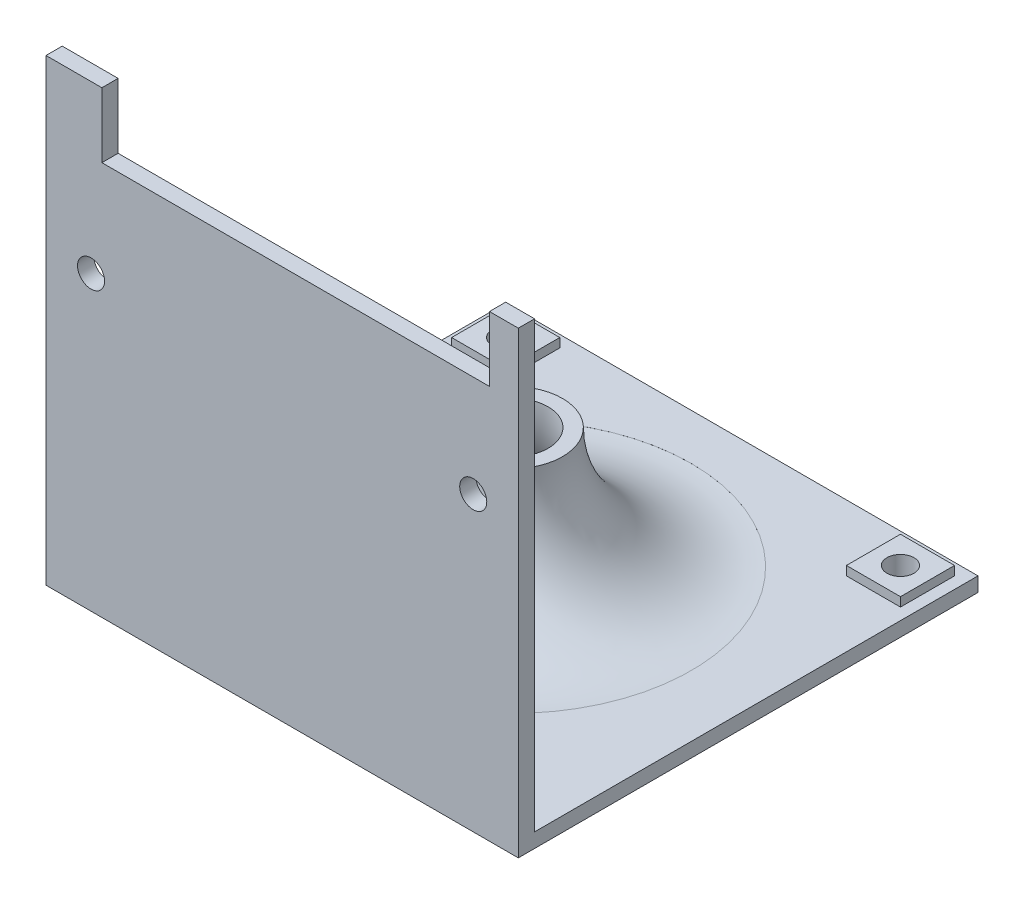
ISO-10303-21;
HEADER;
FILE_DESCRIPTION(('STEP AP214'),'2;1');
FILE_NAME('part.step','',(''),(''),'','','');
FILE_SCHEMA(('AUTOMOTIVE_DESIGN { 1 0 10303 214 1 1 1 1 }'));
ENDSEC;
DATA;
#1=APPLICATION_CONTEXT('core data for automotive mechanical design processes');
#2=APPLICATION_PROTOCOL_DEFINITION('international standard','automotive_design',2000,#1);
#3=PRODUCT_CONTEXT('',#1,'mechanical');
#4=PRODUCT('Part','Part','',(#3));
#5=PRODUCT_RELATED_PRODUCT_CATEGORY('part','',(#4));
#6=PRODUCT_DEFINITION_FORMATION('','',#4);
#7=PRODUCT_DEFINITION_CONTEXT('part definition',#1,'design');
#8=PRODUCT_DEFINITION('design','',#6,#7);
#9=PRODUCT_DEFINITION_SHAPE('','',#8);
#10=(LENGTH_UNIT() NAMED_UNIT(*) SI_UNIT(.MILLI.,.METRE.));
#11=(NAMED_UNIT(*) PLANE_ANGLE_UNIT() SI_UNIT($,.RADIAN.));
#12=(NAMED_UNIT(*) SI_UNIT($,.STERADIAN.) SOLID_ANGLE_UNIT());
#13=UNCERTAINTY_MEASURE_WITH_UNIT(LENGTH_MEASURE(1.E-05),#10,'distance_accuracy_value','');
#14=(GEOMETRIC_REPRESENTATION_CONTEXT(3) GLOBAL_UNCERTAINTY_ASSIGNED_CONTEXT((#13)) GLOBAL_UNIT_ASSIGNED_CONTEXT((#10,
#11,#12)) REPRESENTATION_CONTEXT('',''));
#15=CARTESIAN_POINT('',(0.,0.,0.));
#16=DIRECTION('',(0.,0.,1.));
#17=DIRECTION('',(1.,0.,0.));
#18=AXIS2_PLACEMENT_3D('',#15,#16,#17);
#19=CARTESIAN_POINT('',(0.,50.9,0.));
#20=DIRECTION('',(0.,1.,0.));
#21=DIRECTION('',(0.,0.,1.));
#22=AXIS2_PLACEMENT_3D('',#19,#20,#21);
#23=PLANE('',#22);
#24=DIRECTION('',(0.,0.,-1.));
#25=VECTOR('',#24,1.);
#26=CARTESIAN_POINT('',(23.5,50.9,0.));
#27=LINE('',#26,#25);
#28=CARTESIAN_POINT('',(23.5,50.9,26.));
#29=VERTEX_POINT('',#28);
#30=CARTESIAN_POINT('',(23.5,50.9,24.2));
#31=VERTEX_POINT('',#30);
#32=EDGE_CURVE('E41',#29,#31,#27,.T.);
#33=ORIENTED_EDGE('',*,*,#32,.F.);
#34=DIRECTION('',(1.,0.,0.));
#35=VECTOR('',#34,1.);
#36=CARTESIAN_POINT('',(26.7,50.9,26.));
#37=LINE('',#36,#35);
#38=CARTESIAN_POINT('',(26.7,50.9,26.));
#39=VERTEX_POINT('',#38);
#40=EDGE_CURVE('E175',#29,#39,#37,.T.);
#41=ORIENTED_EDGE('',*,*,#40,.T.);
#42=DIRECTION('',(0.,0.,-1.));
#43=VECTOR('',#42,1.);
#44=CARTESIAN_POINT('',(26.7,50.9,26.));
#45=LINE('',#44,#43);
#46=CARTESIAN_POINT('',(26.7,50.9,24.2));
#47=VERTEX_POINT('',#46);
#48=EDGE_CURVE('E196',#39,#47,#45,.T.);
#49=ORIENTED_EDGE('',*,*,#48,.T.);
#50=DIRECTION('',(-1.,0.,0.));
#51=VECTOR('',#50,1.);
#52=CARTESIAN_POINT('',(26.7,50.9,24.2));
#53=LINE('',#52,#51);
#54=EDGE_CURVE('E177',#47,#31,#53,.T.);
#55=ORIENTED_EDGE('',*,*,#54,.T.);
#56=EDGE_LOOP('',(#33,#41,#49,#55));
#57=FACE_BOUND('',#56,.T.);
#58=ADVANCED_FACE('F33',(#57),#23,.T.);
#59=CARTESIAN_POINT('',(0.,1.6,0.));
#60=DIRECTION('',(0.,1.,0.));
#61=DIRECTION('',(0.,0.,1.));
#62=AXIS2_PLACEMENT_3D('',#59,#60,#61);
#63=PLANE('',#62);
#64=DIRECTION('',(-1.,0.,0.));
#65=VECTOR('',#64,1.);
#66=CARTESIAN_POINT('',(26.7,1.6,24.2));
#67=LINE('',#66,#65);
#68=CARTESIAN_POINT('',(26.7,1.6,24.2));
#69=VERTEX_POINT('',#68);
#70=CARTESIAN_POINT('',(-25.7,1.6,24.2));
#71=VERTEX_POINT('',#70);
#72=EDGE_CURVE('E193',#69,#71,#67,.T.);
#73=ORIENTED_EDGE('',*,*,#72,.F.);
#74=DIRECTION('',(0.,0.,-1.));
#75=VECTOR('',#74,1.);
#76=CARTESIAN_POINT('',(26.7,1.6,-25.));
#77=LINE('',#76,#75);
#78=CARTESIAN_POINT('',(26.7,1.6,-25.));
#79=VERTEX_POINT('',#78);
#80=EDGE_CURVE('E209',#69,#79,#77,.T.);
#81=ORIENTED_EDGE('',*,*,#80,.T.);
#82=DIRECTION('',(-1.,0.,0.));
#83=VECTOR('',#82,1.);
#84=CARTESIAN_POINT('',(-25.7,1.6,-25.));
#85=LINE('',#84,#83);
#86=CARTESIAN_POINT('',(-25.7,1.6,-25.));
#87=VERTEX_POINT('',#86);
#88=EDGE_CURVE('E212',#79,#87,#85,.T.);
#89=ORIENTED_EDGE('',*,*,#88,.T.);
#90=DIRECTION('',(0.,0.,1.));
#91=VECTOR('',#90,1.);
#92=CARTESIAN_POINT('',(-25.7,1.6,-25.));
#93=LINE('',#92,#91);
#94=EDGE_CURVE('E207',#87,#71,#93,.T.);
#95=ORIENTED_EDGE('',*,*,#94,.T.);
#96=EDGE_LOOP('',(#73,#81,#89,#95));
#97=FACE_BOUND('',#96,.T.);
#98=CARTESIAN_POINT('',(0.,1.6,0.));
#99=DIRECTION('',(0.,1.,0.));
#100=DIRECTION('',(0.,0.,1.));
#101=AXIS2_PLACEMENT_3D('',#98,#99,#100);
#102=CIRCLE('',#101,19.8968814968815);
#103=CARTESIAN_POINT('',(0.,1.6,19.8968814968815));
#104=VERTEX_POINT('',#103);
#105=EDGE_CURVE('E203',#104,#104,#102,.T.);
#106=ORIENTED_EDGE('',*,*,#105,.F.);
#107=EDGE_LOOP('',(#106));
#108=FACE_BOUND('',#107,.T.);
#109=DIRECTION('',(-1.,0.,0.));
#110=VECTOR('',#109,1.);
#111=CARTESIAN_POINT('',(25.4,1.6,-23.7));
#112=LINE('',#111,#110);
#113=CARTESIAN_POINT('',(25.4,1.6,-23.7));
#114=VERTEX_POINT('',#113);
#115=CARTESIAN_POINT('',(19.4,1.6,-23.7));
#116=VERTEX_POINT('',#115);
#117=EDGE_CURVE('E308',#114,#116,#112,.T.);
#118=ORIENTED_EDGE('',*,*,#117,.F.);
#119=DIRECTION('',(0.,0.,-1.));
#120=VECTOR('',#119,1.);
#121=CARTESIAN_POINT('',(25.4,1.6,-23.7));
#122=LINE('',#121,#120);
#123=CARTESIAN_POINT('',(25.4,1.6,-17.7));
#124=VERTEX_POINT('',#123);
#125=EDGE_CURVE('E294',#124,#114,#122,.T.);
#126=ORIENTED_EDGE('',*,*,#125,.F.);
#127=DIRECTION('',(1.,0.,0.));
#128=VECTOR('',#127,1.);
#129=CARTESIAN_POINT('',(25.4,1.6,-17.7));
#130=LINE('',#129,#128);
#131=CARTESIAN_POINT('',(19.4,1.6,-17.7));
#132=VERTEX_POINT('',#131);
#133=EDGE_CURVE('E299',#132,#124,#130,.T.);
#134=ORIENTED_EDGE('',*,*,#133,.F.);
#135=DIRECTION('',(0.,0.,1.));
#136=VECTOR('',#135,1.);
#137=CARTESIAN_POINT('',(19.4,1.6,-23.7));
#138=LINE('',#137,#136);
#139=EDGE_CURVE('E310',#116,#132,#138,.T.);
#140=ORIENTED_EDGE('',*,*,#139,.F.);
#141=EDGE_LOOP('',(#118,#126,#134,#140));
#142=FACE_BOUND('',#141,.T.);
#143=DIRECTION('',(1.,0.,0.));
#144=VECTOR('',#143,1.);
#145=CARTESIAN_POINT('',(-24.4,1.6,-17.7));
#146=LINE('',#145,#144);
#147=CARTESIAN_POINT('',(-24.4,1.6,-17.7));
#148=VERTEX_POINT('',#147);
#149=CARTESIAN_POINT('',(-18.4,1.6,-17.7));
#150=VERTEX_POINT('',#149);
#151=EDGE_CURVE('E281',#148,#150,#146,.T.);
#152=ORIENTED_EDGE('',*,*,#151,.F.);
#153=DIRECTION('',(0.,0.,1.));
#154=VECTOR('',#153,1.);
#155=CARTESIAN_POINT('',(-24.4,1.6,-23.7));
#156=LINE('',#155,#154);
#157=CARTESIAN_POINT('',(-24.4,1.6,-23.7));
#158=VERTEX_POINT('',#157);
#159=EDGE_CURVE('E267',#158,#148,#156,.T.);
#160=ORIENTED_EDGE('',*,*,#159,.F.);
#161=DIRECTION('',(-1.,0.,0.));
#162=VECTOR('',#161,1.);
#163=CARTESIAN_POINT('',(-24.4,1.6,-23.7));
#164=LINE('',#163,#162);
#165=CARTESIAN_POINT('',(-18.4,1.6,-23.7));
#166=VERTEX_POINT('',#165);
#167=EDGE_CURVE('E272',#166,#158,#164,.T.);
#168=ORIENTED_EDGE('',*,*,#167,.F.);
#169=DIRECTION('',(0.,0.,-1.));
#170=VECTOR('',#169,1.);
#171=CARTESIAN_POINT('',(-18.4,1.6,-23.7));
#172=LINE('',#171,#170);
#173=EDGE_CURVE('E283',#150,#166,#172,.T.);
#174=ORIENTED_EDGE('',*,*,#173,.F.);
#175=EDGE_LOOP('',(#152,#160,#168,#174));
#176=FACE_BOUND('',#175,.T.);
#177=ADVANCED_FACE('F365',(#97,#108,#142,#176),#63,.T.);
#178=CARTESIAN_POINT('',(0.,15.,0.));
#179=DIRECTION('',(0.,-1.,0.));
#180=DIRECTION('',(0.,0.,-1.));
#181=AXIS2_PLACEMENT_3D('',#178,#179,#180);
#182=TOROIDAL_SURFACE('',#181,19.03125,15.03125);
#183=CARTESIAN_POINT('',(0.,0.,0.));
#184=DIRECTION('',(0.,1.,0.));
#185=DIRECTION('',(0.,0.,1.));
#186=AXIS2_PLACEMENT_3D('',#183,#184,#185);
#187=CIRCLE('',#186,20.);
#188=CARTESIAN_POINT('',(0.,0.,20.));
#189=VERTEX_POINT('',#188);
#190=EDGE_CURVE('E231',#189,#189,#187,.F.);
#191=ORIENTED_EDGE('',*,*,#190,.T.);
#192=EDGE_LOOP('',(#191));
#193=FACE_BOUND('',#192,.T.);
#194=CARTESIAN_POINT('',(0.,15.,0.));
#195=DIRECTION('',(0.,-1.,0.));
#196=DIRECTION('',(0.,0.,-1.));
#197=AXIS2_PLACEMENT_3D('',#194,#195,#196);
#198=CIRCLE('',#197,4.);
#199=CARTESIAN_POINT('',(0.,15.,-4.));
#200=VERTEX_POINT('',#199);
#201=EDGE_CURVE('E234',#200,#200,#198,.T.);
#202=ORIENTED_EDGE('',*,*,#201,.F.);
#203=EDGE_LOOP('',(#202));
#204=FACE_BOUND('',#203,.T.);
#205=ADVANCED_FACE('F35',(#193,#204),#182,.T.);
#206=CARTESIAN_POINT('',(0.,15.,0.));
#207=DIRECTION('',(0.,-1.,0.));
#208=DIRECTION('',(0.,0.,-1.));
#209=AXIS2_PLACEMENT_3D('',#206,#207,#208);
#210=TOROIDAL_SURFACE('',#209,19.03125,13.43125);
#211=CARTESIAN_POINT('',(0.,15.,0.));
#212=DIRECTION('',(0.,-1.,0.));
#213=DIRECTION('',(0.,0.,-1.));
#214=AXIS2_PLACEMENT_3D('',#211,#212,#213);
#215=CIRCLE('',#214,5.6);
#216=CARTESIAN_POINT('',(0.,15.,-5.6));
#217=VERTEX_POINT('',#216);
#218=EDGE_CURVE('E237',#217,#217,#215,.T.);
#219=ORIENTED_EDGE('',*,*,#218,.T.);
#220=EDGE_LOOP('',(#219));
#221=FACE_BOUND('',#220,.T.);
#222=CARTESIAN_POINT('',(0.,1.5966735966736,0.));
#223=DIRECTION('',(0.,-1.,0.));
#224=DIRECTION('',(0.,0.,-1.));
#225=AXIS2_PLACEMENT_3D('',#222,#223,#224);
#226=CIRCLE('',#225,19.8968814968815);
#227=CARTESIAN_POINT('',(0.,1.5966735966736,-19.8968814968815));
#228=VERTEX_POINT('',#227);
#229=EDGE_CURVE('E240',#228,#228,#226,.T.);
#230=ORIENTED_EDGE('',*,*,#229,.F.);
#231=EDGE_LOOP('',(#230));
#232=FACE_BOUND('',#231,.T.);
#233=ADVANCED_FACE('F409',(#221,#232),#210,.F.);
#234=CARTESIAN_POINT('',(4.,15.,0.));
#235=DIRECTION('',(0.,1.,0.));
#236=DIRECTION('',(0.,0.,1.));
#237=AXIS2_PLACEMENT_3D('',#234,#235,#236);
#238=PLANE('',#237);
#239=ORIENTED_EDGE('',*,*,#201,.T.);
#240=EDGE_LOOP('',(#239));
#241=FACE_BOUND('',#240,.T.);
#242=ORIENTED_EDGE('',*,*,#218,.F.);
#243=EDGE_LOOP('',(#242));
#244=FACE_BOUND('',#243,.T.);
#245=ADVANCED_FACE('F394',(#241,#244),#238,.T.);
#246=CARTESIAN_POINT('',(0.,0.,0.));
#247=DIRECTION('',(0.,1.,0.));
#248=DIRECTION('',(0.,0.,1.));
#249=AXIS2_PLACEMENT_3D('',#246,#247,#248);
#250=PLANE('',#249);
#251=CARTESIAN_POINT('',(22.4,0.,-20.7));
#252=DIRECTION('',(0.,1.,0.));
#253=DIRECTION('',(0.,0.,1.));
#254=AXIS2_PLACEMENT_3D('',#251,#252,#253);
#255=CIRCLE('',#254,1.5);
#256=CARTESIAN_POINT('',(22.4,0.,-19.2));
#257=VERTEX_POINT('',#256);
#258=EDGE_CURVE('E264',#257,#257,#255,.T.);
#259=ORIENTED_EDGE('',*,*,#258,.T.);
#260=EDGE_LOOP('',(#259));
#261=FACE_BOUND('',#260,.T.);
#262=CARTESIAN_POINT('',(-21.4,0.,-20.7));
#263=DIRECTION('',(0.,1.,0.));
#264=DIRECTION('',(0.,0.,1.));
#265=AXIS2_PLACEMENT_3D('',#262,#263,#264);
#266=CIRCLE('',#265,1.5);
#267=CARTESIAN_POINT('',(-21.4,0.,-19.2));
#268=VERTEX_POINT('',#267);
#269=EDGE_CURVE('E258',#268,#268,#266,.T.);
#270=ORIENTED_EDGE('',*,*,#269,.T.);
#271=EDGE_LOOP('',(#270));
#272=FACE_BOUND('',#271,.T.);
#273=ORIENTED_EDGE('',*,*,#190,.F.);
#274=EDGE_LOOP('',(#273));
#275=FACE_BOUND('',#274,.T.);
#276=DIRECTION('',(0.,0.,1.));
#277=VECTOR('',#276,1.);
#278=CARTESIAN_POINT('',(-25.7,0.,-25.));
#279=LINE('',#278,#277);
#280=CARTESIAN_POINT('',(-25.7,0.,-25.));
#281=VERTEX_POINT('',#280);
#282=CARTESIAN_POINT('',(-25.7,0.,26.));
#283=VERTEX_POINT('',#282);
#284=EDGE_CURVE('E206',#281,#283,#279,.T.);
#285=ORIENTED_EDGE('',*,*,#284,.F.);
#286=DIRECTION('',(-1.,0.,0.));
#287=VECTOR('',#286,1.);
#288=CARTESIAN_POINT('',(-25.7,0.,-25.));
#289=LINE('',#288,#287);
#290=CARTESIAN_POINT('',(26.7,0.,-25.));
#291=VERTEX_POINT('',#290);
#292=EDGE_CURVE('E210',#291,#281,#289,.T.);
#293=ORIENTED_EDGE('',*,*,#292,.F.);
#294=DIRECTION('',(0.,0.,-1.));
#295=VECTOR('',#294,1.);
#296=CARTESIAN_POINT('',(26.7,0.,-25.));
#297=LINE('',#296,#295);
#298=CARTESIAN_POINT('',(26.7,0.,26.));
#299=VERTEX_POINT('',#298);
#300=EDGE_CURVE('E219',#299,#291,#297,.T.);
#301=ORIENTED_EDGE('',*,*,#300,.F.);
#302=DIRECTION('',(1.,0.,0.));
#303=VECTOR('',#302,1.);
#304=CARTESIAN_POINT('',(-25.7,0.,26.));
#305=LINE('',#304,#303);
#306=EDGE_CURVE('E217',#283,#299,#305,.T.);
#307=ORIENTED_EDGE('',*,*,#306,.F.);
#308=EDGE_LOOP('',(#285,#293,#301,#307));
#309=FACE_BOUND('',#308,.T.);
#310=ADVANCED_FACE('F391',(#261,#272,#275,#309),#250,.F.);
#311=CARTESIAN_POINT('',(-25.7,1.6,-25.));
#312=DIRECTION('',(1.,0.,0.));
#313=DIRECTION('',(0.,0.,-1.));
#314=AXIS2_PLACEMENT_3D('',#311,#312,#313);
#315=PLANE('',#314);
#316=ORIENTED_EDGE('',*,*,#284,.T.);
#317=DIRECTION('',(0.,-1.,0.));
#318=VECTOR('',#317,1.);
#319=CARTESIAN_POINT('',(-25.7,1.6,26.));
#320=LINE('',#319,#318);
#321=CARTESIAN_POINT('',(-25.7,50.9,26.));
#322=VERTEX_POINT('',#321);
#323=EDGE_CURVE('E228',#322,#283,#320,.T.);
#324=ORIENTED_EDGE('',*,*,#323,.F.);
#325=DIRECTION('',(0.,0.,1.));
#326=VECTOR('',#325,1.);
#327=CARTESIAN_POINT('',(-25.7,50.9,26.));
#328=LINE('',#327,#326);
#329=CARTESIAN_POINT('',(-25.7,50.9,24.2));
#330=VERTEX_POINT('',#329);
#331=EDGE_CURVE('E185',#330,#322,#328,.T.);
#332=ORIENTED_EDGE('',*,*,#331,.F.);
#333=DIRECTION('',(0.,-1.,0.));
#334=VECTOR('',#333,1.);
#335=CARTESIAN_POINT('',(-25.7,50.9,24.2));
#336=LINE('',#335,#334);
#337=EDGE_CURVE('E188',#330,#71,#336,.T.);
#338=ORIENTED_EDGE('',*,*,#337,.T.);
#339=ORIENTED_EDGE('',*,*,#94,.F.);
#340=DIRECTION('',(0.,-1.,0.));
#341=VECTOR('',#340,1.);
#342=CARTESIAN_POINT('',(-25.7,1.6,-25.));
#343=LINE('',#342,#341);
#344=EDGE_CURVE('E214',#87,#281,#343,.T.);
#345=ORIENTED_EDGE('',*,*,#344,.T.);
#346=EDGE_LOOP('',(#316,#324,#332,#338,#339,#345));
#347=FACE_BOUND('',#346,.T.);
#348=ADVANCED_FACE('F333',(#347),#315,.F.);
#349=CARTESIAN_POINT('',(-25.7,1.6,26.));
#350=DIRECTION('',(0.,0.,-1.));
#351=DIRECTION('',(-1.,0.,0.));
#352=AXIS2_PLACEMENT_3D('',#349,#350,#351);
#353=PLANE('',#352);
#354=CARTESIAN_POINT('',(-20.7,32.45,26.));
#355=DIRECTION('',(0.,0.,1.));
#356=DIRECTION('',(1.,0.,0.));
#357=AXIS2_PLACEMENT_3D('',#354,#355,#356);
#358=CIRCLE('',#357,1.5);
#359=CARTESIAN_POINT('',(-19.2,32.45,26.));
#360=VERTEX_POINT('',#359);
#361=EDGE_CURVE('E170',#360,#360,#358,.T.);
#362=ORIENTED_EDGE('',*,*,#361,.F.);
#363=EDGE_LOOP('',(#362));
#364=FACE_BOUND('',#363,.T.);
#365=CARTESIAN_POINT('',(21.7,32.45,26.));
#366=DIRECTION('',(0.,0.,1.));
#367=DIRECTION('',(1.,0.,0.));
#368=AXIS2_PLACEMENT_3D('',#365,#366,#367);
#369=CIRCLE('',#368,1.5);
#370=CARTESIAN_POINT('',(23.2,32.45,26.));
#371=VERTEX_POINT('',#370);
#372=EDGE_CURVE('E346',#371,#371,#369,.T.);
#373=ORIENTED_EDGE('',*,*,#372,.F.);
#374=EDGE_LOOP('',(#373));
#375=FACE_BOUND('',#374,.T.);
#376=ORIENTED_EDGE('',*,*,#40,.F.);
#377=DIRECTION('',(0.,1.,0.));
#378=VECTOR('',#377,1.);
#379=CARTESIAN_POINT('',(23.5,50.9,26.));
#380=LINE('',#379,#378);
#381=CARTESIAN_POINT('',(23.5,43.7,26.));
#382=VERTEX_POINT('',#381);
#383=EDGE_CURVE('E159',#382,#29,#380,.T.);
#384=ORIENTED_EDGE('',*,*,#383,.F.);
#385=DIRECTION('',(1.,0.,0.));
#386=VECTOR('',#385,1.);
#387=CARTESIAN_POINT('',(23.5,43.7,26.));
#388=LINE('',#387,#386);
#389=CARTESIAN_POINT('',(-19.5,43.7,26.));
#390=VERTEX_POINT('',#389);
#391=EDGE_CURVE('E337',#390,#382,#388,.T.);
#392=ORIENTED_EDGE('',*,*,#391,.F.);
#393=DIRECTION('',(0.,-1.,0.));
#394=VECTOR('',#393,1.);
#395=CARTESIAN_POINT('',(-19.5,50.9,26.));
#396=LINE('',#395,#394);
#397=CARTESIAN_POINT('',(-19.5,50.9,26.));
#398=VERTEX_POINT('',#397);
#399=EDGE_CURVE('E169',#398,#390,#396,.T.);
#400=ORIENTED_EDGE('',*,*,#399,.F.);
#401=EDGE_CURVE('E184',#322,#398,#37,.T.);
#402=ORIENTED_EDGE('',*,*,#401,.F.);
#403=ORIENTED_EDGE('',*,*,#323,.T.);
#404=ORIENTED_EDGE('',*,*,#306,.T.);
#405=DIRECTION('',(0.,-1.,0.));
#406=VECTOR('',#405,1.);
#407=CARTESIAN_POINT('',(26.7,1.6,26.));
#408=LINE('',#407,#406);
#409=EDGE_CURVE('E182',#39,#299,#408,.T.);
#410=ORIENTED_EDGE('',*,*,#409,.F.);
#411=EDGE_LOOP('',(#376,#384,#392,#400,#402,#403,#404,#410));
#412=FACE_BOUND('',#411,.T.);
#413=ADVANCED_FACE('F180',(#364,#375,#412),#353,.F.);
#414=CARTESIAN_POINT('',(26.7,1.6,-25.));
#415=DIRECTION('',(-1.,0.,0.));
#416=DIRECTION('',(0.,0.,1.));
#417=AXIS2_PLACEMENT_3D('',#414,#415,#416);
#418=PLANE('',#417);
#419=ORIENTED_EDGE('',*,*,#300,.T.);
#420=DIRECTION('',(0.,-1.,0.));
#421=VECTOR('',#420,1.);
#422=CARTESIAN_POINT('',(26.7,1.6,-25.));
#423=LINE('',#422,#421);
#424=EDGE_CURVE('E224',#79,#291,#423,.T.);
#425=ORIENTED_EDGE('',*,*,#424,.F.);
#426=ORIENTED_EDGE('',*,*,#80,.F.);
#427=DIRECTION('',(0.,-1.,0.));
#428=VECTOR('',#427,1.);
#429=CARTESIAN_POINT('',(26.7,50.9,24.2));
#430=LINE('',#429,#428);
#431=EDGE_CURVE('E200',#47,#69,#430,.T.);
#432=ORIENTED_EDGE('',*,*,#431,.F.);
#433=ORIENTED_EDGE('',*,*,#48,.F.);
#434=ORIENTED_EDGE('',*,*,#409,.T.);
#435=EDGE_LOOP('',(#419,#425,#426,#432,#433,#434));
#436=FACE_BOUND('',#435,.T.);
#437=ADVANCED_FACE('F398',(#436),#418,.F.);
#438=CARTESIAN_POINT('',(-25.7,1.6,-25.));
#439=DIRECTION('',(0.,0.,1.));
#440=DIRECTION('',(1.,0.,0.));
#441=AXIS2_PLACEMENT_3D('',#438,#439,#440);
#442=PLANE('',#441);
#443=ORIENTED_EDGE('',*,*,#292,.T.);
#444=ORIENTED_EDGE('',*,*,#344,.F.);
#445=ORIENTED_EDGE('',*,*,#88,.F.);
#446=ORIENTED_EDGE('',*,*,#424,.T.);
#447=EDGE_LOOP('',(#443,#444,#445,#446));
#448=FACE_BOUND('',#447,.T.);
#449=ADVANCED_FACE('F386',(#448),#442,.F.);
#450=CARTESIAN_POINT('',(0.,1.6,0.));
#451=DIRECTION('',(0.,-1.,0.));
#452=DIRECTION('',(0.,0.,-1.));
#453=AXIS2_PLACEMENT_3D('',#450,#451,#452);
#454=CYLINDRICAL_SURFACE('',#453,19.8968814968815);
#455=ORIENTED_EDGE('',*,*,#229,.T.);
#456=EDGE_LOOP('',(#455));
#457=FACE_BOUND('',#456,.T.);
#458=ORIENTED_EDGE('',*,*,#105,.T.);
#459=EDGE_LOOP('',(#458));
#460=FACE_BOUND('',#459,.T.);
#461=ADVANCED_FACE('F382',(#457,#460),#454,.F.);
#462=CARTESIAN_POINT('',(26.7,50.9,24.2));
#463=DIRECTION('',(0.,0.,1.));
#464=DIRECTION('',(1.,0.,0.));
#465=AXIS2_PLACEMENT_3D('',#462,#463,#464);
#466=PLANE('',#465);
#467=CARTESIAN_POINT('',(-20.7,32.45,24.2));
#468=DIRECTION('',(0.,0.,1.));
#469=DIRECTION('',(1.,0.,0.));
#470=AXIS2_PLACEMENT_3D('',#467,#468,#469);
#471=CIRCLE('',#470,1.5);
#472=CARTESIAN_POINT('',(-19.2,32.45,24.2));
#473=VERTEX_POINT('',#472);
#474=EDGE_CURVE('E246',#473,#473,#471,.T.);
#475=ORIENTED_EDGE('',*,*,#474,.T.);
#476=EDGE_LOOP('',(#475));
#477=FACE_BOUND('',#476,.T.);
#478=CARTESIAN_POINT('',(21.7,32.45,24.2));
#479=DIRECTION('',(0.,0.,1.));
#480=DIRECTION('',(1.,0.,0.));
#481=AXIS2_PLACEMENT_3D('',#478,#479,#480);
#482=CIRCLE('',#481,1.5);
#483=CARTESIAN_POINT('',(23.2,32.45,24.2));
#484=VERTEX_POINT('',#483);
#485=EDGE_CURVE('E244',#484,#484,#482,.T.);
#486=ORIENTED_EDGE('',*,*,#485,.T.);
#487=EDGE_LOOP('',(#486));
#488=FACE_BOUND('',#487,.T.);
#489=DIRECTION('',(1.,0.,0.));
#490=VECTOR('',#489,1.);
#491=CARTESIAN_POINT('',(26.7,43.7,24.2));
#492=LINE('',#491,#490);
#493=CARTESIAN_POINT('',(-19.5,43.7,24.2));
#494=VERTEX_POINT('',#493);
#495=CARTESIAN_POINT('',(23.5,43.7,24.2));
#496=VERTEX_POINT('',#495);
#497=EDGE_CURVE('E11',#494,#496,#492,.T.);
#498=ORIENTED_EDGE('',*,*,#497,.T.);
#499=DIRECTION('',(0.,1.,0.));
#500=VECTOR('',#499,1.);
#501=CARTESIAN_POINT('',(23.5,50.9,24.2));
#502=LINE('',#501,#500);
#503=EDGE_CURVE('E247',#496,#31,#502,.T.);
#504=ORIENTED_EDGE('',*,*,#503,.T.);
#505=ORIENTED_EDGE('',*,*,#54,.F.);
#506=ORIENTED_EDGE('',*,*,#431,.T.);
#507=ORIENTED_EDGE('',*,*,#72,.T.);
#508=ORIENTED_EDGE('',*,*,#337,.F.);
#509=CARTESIAN_POINT('',(-19.5,50.9,24.2));
#510=VERTEX_POINT('',#509);
#511=EDGE_CURVE('E322',#510,#330,#53,.T.);
#512=ORIENTED_EDGE('',*,*,#511,.F.);
#513=DIRECTION('',(0.,-1.,0.));
#514=VECTOR('',#513,1.);
#515=CARTESIAN_POINT('',(-19.5,50.9,24.2));
#516=LINE('',#515,#514);
#517=EDGE_CURVE('E48',#510,#494,#516,.T.);
#518=ORIENTED_EDGE('',*,*,#517,.T.);
#519=EDGE_LOOP('',(#498,#504,#505,#506,#507,#508,#512,#518));
#520=FACE_BOUND('',#519,.T.);
#521=ADVANCED_FACE('F330',(#477,#488,#520),#466,.F.);
#522=DIRECTION('',(0.,0.,1.));
#523=VECTOR('',#522,1.);
#524=CARTESIAN_POINT('',(-19.5,50.9,0.));
#525=LINE('',#524,#523);
#526=EDGE_CURVE('E178',#510,#398,#525,.T.);
#527=ORIENTED_EDGE('',*,*,#526,.F.);
#528=ORIENTED_EDGE('',*,*,#511,.T.);
#529=ORIENTED_EDGE('',*,*,#331,.T.);
#530=ORIENTED_EDGE('',*,*,#401,.T.);
#531=EDGE_LOOP('',(#527,#528,#529,#530));
#532=FACE_BOUND('',#531,.T.);
#533=ADVANCED_FACE('F326',(#532),#23,.T.);
#534=CARTESIAN_POINT('',(25.4,2.6,-23.7));
#535=DIRECTION('',(-1.,0.,0.));
#536=DIRECTION('',(0.,0.,1.));
#537=AXIS2_PLACEMENT_3D('',#534,#535,#536);
#538=PLANE('',#537);
#539=ORIENTED_EDGE('',*,*,#125,.T.);
#540=DIRECTION('',(0.,-1.,0.));
#541=VECTOR('',#540,1.);
#542=CARTESIAN_POINT('',(25.4,2.6,-23.7));
#543=LINE('',#542,#541);
#544=CARTESIAN_POINT('',(25.4,2.6,-23.7));
#545=VERTEX_POINT('',#544);
#546=EDGE_CURVE('E197',#545,#114,#543,.T.);
#547=ORIENTED_EDGE('',*,*,#546,.F.);
#548=DIRECTION('',(0.,0.,-1.));
#549=VECTOR('',#548,1.);
#550=CARTESIAN_POINT('',(25.4,2.6,-23.7));
#551=LINE('',#550,#549);
#552=CARTESIAN_POINT('',(25.4,2.6,-17.7));
#553=VERTEX_POINT('',#552);
#554=EDGE_CURVE('E295',#553,#545,#551,.T.);
#555=ORIENTED_EDGE('',*,*,#554,.F.);
#556=DIRECTION('',(0.,-1.,0.));
#557=VECTOR('',#556,1.);
#558=CARTESIAN_POINT('',(25.4,2.6,-17.7));
#559=LINE('',#558,#557);
#560=EDGE_CURVE('E305',#553,#124,#559,.T.);
#561=ORIENTED_EDGE('',*,*,#560,.T.);
#562=EDGE_LOOP('',(#539,#547,#555,#561));
#563=FACE_BOUND('',#562,.T.);
#564=ADVANCED_FACE('F375',(#563),#538,.F.);
#565=CARTESIAN_POINT('',(25.4,2.6,-23.7));
#566=DIRECTION('',(0.,0.,1.));
#567=DIRECTION('',(1.,0.,0.));
#568=AXIS2_PLACEMENT_3D('',#565,#566,#567);
#569=PLANE('',#568);
#570=ORIENTED_EDGE('',*,*,#117,.T.);
#571=DIRECTION('',(0.,-1.,0.));
#572=VECTOR('',#571,1.);
#573=CARTESIAN_POINT('',(19.4,2.6,-23.7));
#574=LINE('',#573,#572);
#575=CARTESIAN_POINT('',(19.4,2.6,-23.7));
#576=VERTEX_POINT('',#575);
#577=EDGE_CURVE('E318',#576,#116,#574,.T.);
#578=ORIENTED_EDGE('',*,*,#577,.F.);
#579=DIRECTION('',(-1.,0.,0.));
#580=VECTOR('',#579,1.);
#581=CARTESIAN_POINT('',(25.4,2.6,-23.7));
#582=LINE('',#581,#580);
#583=EDGE_CURVE('E298',#545,#576,#582,.T.);
#584=ORIENTED_EDGE('',*,*,#583,.F.);
#585=ORIENTED_EDGE('',*,*,#546,.T.);
#586=EDGE_LOOP('',(#570,#578,#584,#585));
#587=FACE_BOUND('',#586,.T.);
#588=ADVANCED_FACE('F380',(#587),#569,.F.);
#589=CARTESIAN_POINT('',(19.4,2.6,-23.7));
#590=DIRECTION('',(1.,0.,0.));
#591=DIRECTION('',(0.,0.,-1.));
#592=AXIS2_PLACEMENT_3D('',#589,#590,#591);
#593=PLANE('',#592);
#594=ORIENTED_EDGE('',*,*,#139,.T.);
#595=DIRECTION('',(0.,-1.,0.));
#596=VECTOR('',#595,1.);
#597=CARTESIAN_POINT('',(19.4,2.6,-17.7));
#598=LINE('',#597,#596);
#599=CARTESIAN_POINT('',(19.4,2.6,-17.7));
#600=VERTEX_POINT('',#599);
#601=EDGE_CURVE('E316',#600,#132,#598,.T.);
#602=ORIENTED_EDGE('',*,*,#601,.F.);
#603=DIRECTION('',(0.,0.,1.));
#604=VECTOR('',#603,1.);
#605=CARTESIAN_POINT('',(19.4,2.6,-23.7));
#606=LINE('',#605,#604);
#607=EDGE_CURVE('E301',#576,#600,#606,.T.);
#608=ORIENTED_EDGE('',*,*,#607,.F.);
#609=ORIENTED_EDGE('',*,*,#577,.T.);
#610=EDGE_LOOP('',(#594,#602,#608,#609));
#611=FACE_BOUND('',#610,.T.);
#612=ADVANCED_FACE('F469',(#611),#593,.F.);
#613=CARTESIAN_POINT('',(25.4,2.6,-17.7));
#614=DIRECTION('',(0.,0.,-1.));
#615=DIRECTION('',(-1.,0.,0.));
#616=AXIS2_PLACEMENT_3D('',#613,#614,#615);
#617=PLANE('',#616);
#618=ORIENTED_EDGE('',*,*,#133,.T.);
#619=ORIENTED_EDGE('',*,*,#560,.F.);
#620=DIRECTION('',(1.,0.,0.));
#621=VECTOR('',#620,1.);
#622=CARTESIAN_POINT('',(25.4,2.6,-17.7));
#623=LINE('',#622,#621);
#624=EDGE_CURVE('E303',#600,#553,#623,.T.);
#625=ORIENTED_EDGE('',*,*,#624,.F.);
#626=ORIENTED_EDGE('',*,*,#601,.T.);
#627=EDGE_LOOP('',(#618,#619,#625,#626));
#628=FACE_BOUND('',#627,.T.);
#629=ADVANCED_FACE('F465',(#628),#617,.F.);
#630=CARTESIAN_POINT('',(0.,2.6,0.));
#631=DIRECTION('',(0.,-1.,0.));
#632=DIRECTION('',(0.,0.,-1.));
#633=AXIS2_PLACEMENT_3D('',#630,#631,#632);
#634=PLANE('',#633);
#635=CARTESIAN_POINT('',(22.4,2.6,-20.7));
#636=DIRECTION('',(0.,1.,0.));
#637=DIRECTION('',(0.,0.,1.));
#638=AXIS2_PLACEMENT_3D('',#635,#636,#637);
#639=CIRCLE('',#638,1.5);
#640=CARTESIAN_POINT('',(22.4,2.6,-19.2));
#641=VERTEX_POINT('',#640);
#642=EDGE_CURVE('E253',#641,#641,#639,.T.);
#643=ORIENTED_EDGE('',*,*,#642,.F.);
#644=EDGE_LOOP('',(#643));
#645=FACE_BOUND('',#644,.T.);
#646=ORIENTED_EDGE('',*,*,#554,.T.);
#647=ORIENTED_EDGE('',*,*,#583,.T.);
#648=ORIENTED_EDGE('',*,*,#607,.T.);
#649=ORIENTED_EDGE('',*,*,#624,.T.);
#650=EDGE_LOOP('',(#646,#647,#648,#649));
#651=FACE_BOUND('',#650,.T.);
#652=ADVANCED_FACE('F462',(#645,#651),#634,.F.);
#653=CARTESIAN_POINT('',(-24.4,2.6,-23.7));
#654=DIRECTION('',(1.,0.,0.));
#655=DIRECTION('',(0.,0.,-1.));
#656=AXIS2_PLACEMENT_3D('',#653,#654,#655);
#657=PLANE('',#656);
#658=ORIENTED_EDGE('',*,*,#159,.T.);
#659=DIRECTION('',(0.,-1.,0.));
#660=VECTOR('',#659,1.);
#661=CARTESIAN_POINT('',(-24.4,2.6,-17.7));
#662=LINE('',#661,#660);
#663=CARTESIAN_POINT('',(-24.4,2.6,-17.7));
#664=VERTEX_POINT('',#663);
#665=EDGE_CURVE('E292',#664,#148,#662,.T.);
#666=ORIENTED_EDGE('',*,*,#665,.F.);
#667=DIRECTION('',(0.,0.,1.));
#668=VECTOR('',#667,1.);
#669=CARTESIAN_POINT('',(-24.4,2.6,-23.7));
#670=LINE('',#669,#668);
#671=CARTESIAN_POINT('',(-24.4,2.6,-23.7));
#672=VERTEX_POINT('',#671);
#673=EDGE_CURVE('E268',#672,#664,#670,.T.);
#674=ORIENTED_EDGE('',*,*,#673,.F.);
#675=DIRECTION('',(0.,-1.,0.));
#676=VECTOR('',#675,1.);
#677=CARTESIAN_POINT('',(-24.4,2.6,-23.7));
#678=LINE('',#677,#676);
#679=EDGE_CURVE('E278',#672,#158,#678,.T.);
#680=ORIENTED_EDGE('',*,*,#679,.T.);
#681=EDGE_LOOP('',(#658,#666,#674,#680));
#682=FACE_BOUND('',#681,.T.);
#683=ADVANCED_FACE('F444',(#682),#657,.F.);
#684=CARTESIAN_POINT('',(-24.4,2.6,-17.7));
#685=DIRECTION('',(0.,0.,-1.));
#686=DIRECTION('',(-1.,0.,0.));
#687=AXIS2_PLACEMENT_3D('',#684,#685,#686);
#688=PLANE('',#687);
#689=ORIENTED_EDGE('',*,*,#151,.T.);
#690=DIRECTION('',(0.,-1.,0.));
#691=VECTOR('',#690,1.);
#692=CARTESIAN_POINT('',(-18.4,2.6,-17.7));
#693=LINE('',#692,#691);
#694=CARTESIAN_POINT('',(-18.4,2.6,-17.7));
#695=VERTEX_POINT('',#694);
#696=EDGE_CURVE('E289',#695,#150,#693,.T.);
#697=ORIENTED_EDGE('',*,*,#696,.F.);
#698=DIRECTION('',(1.,0.,0.));
#699=VECTOR('',#698,1.);
#700=CARTESIAN_POINT('',(-24.4,2.6,-17.7));
#701=LINE('',#700,#699);
#702=EDGE_CURVE('E271',#664,#695,#701,.T.);
#703=ORIENTED_EDGE('',*,*,#702,.F.);
#704=ORIENTED_EDGE('',*,*,#665,.T.);
#705=EDGE_LOOP('',(#689,#697,#703,#704));
#706=FACE_BOUND('',#705,.T.);
#707=ADVANCED_FACE('F434',(#706),#688,.F.);
#708=CARTESIAN_POINT('',(-18.4,2.6,-23.7));
#709=DIRECTION('',(-1.,0.,0.));
#710=DIRECTION('',(0.,0.,1.));
#711=AXIS2_PLACEMENT_3D('',#708,#709,#710);
#712=PLANE('',#711);
#713=ORIENTED_EDGE('',*,*,#173,.T.);
#714=DIRECTION('',(0.,-1.,0.));
#715=VECTOR('',#714,1.);
#716=CARTESIAN_POINT('',(-18.4,2.6,-23.7));
#717=LINE('',#716,#715);
#718=CARTESIAN_POINT('',(-18.4,2.6,-23.7));
#719=VERTEX_POINT('',#718);
#720=EDGE_CURVE('E56',#719,#166,#717,.T.);
#721=ORIENTED_EDGE('',*,*,#720,.F.);
#722=DIRECTION('',(0.,0.,-1.));
#723=VECTOR('',#722,1.);
#724=CARTESIAN_POINT('',(-18.4,2.6,-23.7));
#725=LINE('',#724,#723);
#726=EDGE_CURVE('E274',#695,#719,#725,.T.);
#727=ORIENTED_EDGE('',*,*,#726,.F.);
#728=ORIENTED_EDGE('',*,*,#696,.T.);
#729=EDGE_LOOP('',(#713,#721,#727,#728));
#730=FACE_BOUND('',#729,.T.);
#731=ADVANCED_FACE('F438',(#730),#712,.F.);
#732=CARTESIAN_POINT('',(-24.4,2.6,-23.7));
#733=DIRECTION('',(0.,0.,1.));
#734=DIRECTION('',(1.,0.,0.));
#735=AXIS2_PLACEMENT_3D('',#732,#733,#734);
#736=PLANE('',#735);
#737=ORIENTED_EDGE('',*,*,#167,.T.);
#738=ORIENTED_EDGE('',*,*,#679,.F.);
#739=DIRECTION('',(-1.,0.,0.));
#740=VECTOR('',#739,1.);
#741=CARTESIAN_POINT('',(-24.4,2.6,-23.7));
#742=LINE('',#741,#740);
#743=EDGE_CURVE('E276',#719,#672,#742,.T.);
#744=ORIENTED_EDGE('',*,*,#743,.F.);
#745=ORIENTED_EDGE('',*,*,#720,.T.);
#746=EDGE_LOOP('',(#737,#738,#744,#745));
#747=FACE_BOUND('',#746,.T.);
#748=ADVANCED_FACE('F445',(#747),#736,.F.);
#749=CARTESIAN_POINT('',(0.,2.6,0.));
#750=DIRECTION('',(0.,1.,0.));
#751=DIRECTION('',(0.,0.,1.));
#752=AXIS2_PLACEMENT_3D('',#749,#750,#751);
#753=PLANE('',#752);
#754=CARTESIAN_POINT('',(-21.4,2.6,-20.7));
#755=DIRECTION('',(0.,1.,0.));
#756=DIRECTION('',(0.,0.,1.));
#757=AXIS2_PLACEMENT_3D('',#754,#755,#756);
#758=CIRCLE('',#757,1.5);
#759=CARTESIAN_POINT('',(-21.4,2.6,-19.2));
#760=VERTEX_POINT('',#759);
#761=EDGE_CURVE('E249',#760,#760,#758,.T.);
#762=ORIENTED_EDGE('',*,*,#761,.F.);
#763=EDGE_LOOP('',(#762));
#764=FACE_BOUND('',#763,.T.);
#765=ORIENTED_EDGE('',*,*,#673,.T.);
#766=ORIENTED_EDGE('',*,*,#702,.T.);
#767=ORIENTED_EDGE('',*,*,#726,.T.);
#768=ORIENTED_EDGE('',*,*,#743,.T.);
#769=EDGE_LOOP('',(#765,#766,#767,#768));
#770=FACE_BOUND('',#769,.T.);
#771=ADVANCED_FACE('F440',(#764,#770),#753,.T.);
#772=CARTESIAN_POINT('',(-21.4,-0.0312499999999983,-20.7));
#773=DIRECTION('',(0.,1.,0.));
#774=DIRECTION('',(0.,0.,1.));
#775=AXIS2_PLACEMENT_3D('',#772,#773,#774);
#776=CYLINDRICAL_SURFACE('',#775,1.5);
#777=CARTESIAN_POINT('',(-21.4,2.6,-19.2));
#778=CARTESIAN_POINT('',(-21.4,2.57291666666667,-19.2));
#779=CARTESIAN_POINT('',(-21.4,2.54583333333333,-19.2));
#780=CARTESIAN_POINT('',(-21.4,2.49166666666667,-19.2));
#781=CARTESIAN_POINT('',(-21.4,2.46458333333333,-19.2));
#782=CARTESIAN_POINT('',(-21.4,2.41041666666667,-19.2));
#783=CARTESIAN_POINT('',(-21.4,2.38333333333333,-19.2));
#784=CARTESIAN_POINT('',(-21.4,2.32916666666667,-19.2));
#785=CARTESIAN_POINT('',(-21.4,2.30208333333333,-19.2));
#786=CARTESIAN_POINT('',(-21.4,2.24791666666667,-19.2));
#787=CARTESIAN_POINT('',(-21.4,2.22083333333333,-19.2));
#788=CARTESIAN_POINT('',(-21.4,2.16666666666667,-19.2));
#789=CARTESIAN_POINT('',(-21.4,2.13958333333333,-19.2));
#790=CARTESIAN_POINT('',(-21.4,2.08541666666667,-19.2));
#791=CARTESIAN_POINT('',(-21.4,2.05833333333333,-19.2));
#792=CARTESIAN_POINT('',(-21.4,2.00416666666667,-19.2));
#793=CARTESIAN_POINT('',(-21.4,1.97708333333333,-19.2));
#794=CARTESIAN_POINT('',(-21.4,1.92291666666667,-19.2));
#795=CARTESIAN_POINT('',(-21.4,1.89583333333333,-19.2));
#796=CARTESIAN_POINT('',(-21.4,1.84166666666667,-19.2));
#797=CARTESIAN_POINT('',(-21.4,1.81458333333333,-19.2));
#798=CARTESIAN_POINT('',(-21.4,1.76041666666667,-19.2));
#799=CARTESIAN_POINT('',(-21.4,1.73333333333333,-19.2));
#800=CARTESIAN_POINT('',(-21.4,1.67916666666667,-19.2));
#801=CARTESIAN_POINT('',(-21.4,1.65208333333333,-19.2));
#802=CARTESIAN_POINT('',(-21.4,1.59791666666667,-19.2));
#803=CARTESIAN_POINT('',(-21.4,1.57083333333333,-19.2));
#804=CARTESIAN_POINT('',(-21.4,1.51666666666667,-19.2));
#805=CARTESIAN_POINT('',(-21.4,1.48958333333333,-19.2));
#806=CARTESIAN_POINT('',(-21.4,1.43541666666667,-19.2));
#807=CARTESIAN_POINT('',(-21.4,1.40833333333333,-19.2));
#808=CARTESIAN_POINT('',(-21.4,1.35416666666667,-19.2));
#809=CARTESIAN_POINT('',(-21.4,1.32708333333333,-19.2));
#810=CARTESIAN_POINT('',(-21.4,1.27291666666667,-19.2));
#811=CARTESIAN_POINT('',(-21.4,1.24583333333333,-19.2));
#812=CARTESIAN_POINT('',(-21.4,1.19166666666667,-19.2));
#813=CARTESIAN_POINT('',(-21.4,1.16458333333333,-19.2));
#814=CARTESIAN_POINT('',(-21.4,1.11041666666667,-19.2));
#815=CARTESIAN_POINT('',(-21.4,1.08333333333333,-19.2));
#816=CARTESIAN_POINT('',(-21.4,1.02916666666667,-19.2));
#817=CARTESIAN_POINT('',(-21.4,1.00208333333333,-19.2));
#818=CARTESIAN_POINT('',(-21.4,0.947916666666666,-19.2));
#819=CARTESIAN_POINT('',(-21.4,0.920833333333333,-19.2));
#820=CARTESIAN_POINT('',(-21.4,0.866666666666666,-19.2));
#821=CARTESIAN_POINT('',(-21.4,0.839583333333333,-19.2));
#822=CARTESIAN_POINT('',(-21.4,0.785416666666666,-19.2));
#823=CARTESIAN_POINT('',(-21.4,0.758333333333333,-19.2));
#824=CARTESIAN_POINT('',(-21.4,0.704166666666666,-19.2));
#825=CARTESIAN_POINT('',(-21.4,0.677083333333333,-19.2));
#826=CARTESIAN_POINT('',(-21.4,0.622916666666666,-19.2));
#827=CARTESIAN_POINT('',(-21.4,0.595833333333333,-19.2));
#828=CARTESIAN_POINT('',(-21.4,0.541666666666666,-19.2));
#829=CARTESIAN_POINT('',(-21.4,0.514583333333333,-19.2));
#830=CARTESIAN_POINT('',(-21.4,0.460416666666667,-19.2));
#831=CARTESIAN_POINT('',(-21.4,0.433333333333333,-19.2));
#832=CARTESIAN_POINT('',(-21.4,0.379166666666666,-19.2));
#833=CARTESIAN_POINT('',(-21.4,0.352083333333333,-19.2));
#834=CARTESIAN_POINT('',(-21.4,0.297916666666666,-19.2));
#835=CARTESIAN_POINT('',(-21.4,0.270833333333333,-19.2));
#836=CARTESIAN_POINT('',(-21.4,0.216666666666667,-19.2));
#837=CARTESIAN_POINT('',(-21.4,0.189583333333333,-19.2));
#838=CARTESIAN_POINT('',(-21.4,0.135416666666667,-19.2));
#839=CARTESIAN_POINT('',(-21.4,0.108333333333333,-19.2));
#840=CARTESIAN_POINT('',(-21.4,0.0541666666666667,-19.2));
#841=CARTESIAN_POINT('',(-21.4,0.0270833333333333,-19.2));
#842=CARTESIAN_POINT('',(-21.4,0.,-19.2));
#843=B_SPLINE_CURVE_WITH_KNOTS('',3,(#777,#778,#779,#780,#781,#782,#783,#784,#785,#786,#787,
#788,#789,#790,#791,#792,#793,#794,#795,#796,#797,#798,#799,#800,#801,#802,#803,#804,#805,#806,
#807,#808,#809,#810,#811,#812,#813,#814,#815,#816,#817,#818,#819,#820,#821,#822,#823,#824,#825,
#826,#827,#828,#829,#830,#831,#832,#833,#834,#835,#836,#837,#838,#839,#840,#841,#842),
.UNSPECIFIED.,.F.,.F.,(4,2,2,2,2,2,2,2,2,2,2,2,2,2,2,2,2,2,2,2,2,2,2,2,2,2,2,2,2,2,2,2,4),(0.,
0.0812500000000002,0.1625,0.24375,0.325,0.40625,0.4875,0.56875,0.65,0.73125,0.8125,0.89375,
0.975,1.05625,1.1375,1.21875,1.3,1.38125,1.4625,1.54375,1.625,1.70625,1.7875,1.86875,1.95,
2.03125,2.1125,2.19375,2.275,2.35625,2.4375,2.51875,2.6),.UNSPECIFIED.);
#844=EDGE_CURVE('BSEAM452',#760,#268,#843,.T.);
#845=ORIENTED_EDGE('',*,*,#761,.T.);
#846=ORIENTED_EDGE('',*,*,#269,.F.);
#847=ORIENTED_EDGE('',*,*,#844,.T.);
#848=ORIENTED_EDGE('',*,*,#844,.F.);
#849=EDGE_LOOP('',(#845,#847,#846,#848));
#850=FACE_BOUND('',#849,.T.);
#851=ADVANCED_FACE('F452',(#850),#776,.F.);
#852=CARTESIAN_POINT('',(22.4,-0.0312499999999983,-20.7));
#853=DIRECTION('',(0.,1.,0.));
#854=DIRECTION('',(0.,0.,1.));
#855=AXIS2_PLACEMENT_3D('',#852,#853,#854);
#856=CYLINDRICAL_SURFACE('',#855,1.5);
#857=CARTESIAN_POINT('',(22.4,2.6,-19.2));
#858=CARTESIAN_POINT('',(22.4,2.57291666666667,-19.2));
#859=CARTESIAN_POINT('',(22.4,2.54583333333333,-19.2));
#860=CARTESIAN_POINT('',(22.4,2.49166666666667,-19.2));
#861=CARTESIAN_POINT('',(22.4,2.46458333333333,-19.2));
#862=CARTESIAN_POINT('',(22.4,2.41041666666667,-19.2));
#863=CARTESIAN_POINT('',(22.4,2.38333333333333,-19.2));
#864=CARTESIAN_POINT('',(22.4,2.32916666666667,-19.2));
#865=CARTESIAN_POINT('',(22.4,2.30208333333333,-19.2));
#866=CARTESIAN_POINT('',(22.4,2.24791666666667,-19.2));
#867=CARTESIAN_POINT('',(22.4,2.22083333333333,-19.2));
#868=CARTESIAN_POINT('',(22.4,2.16666666666667,-19.2));
#869=CARTESIAN_POINT('',(22.4,2.13958333333333,-19.2));
#870=CARTESIAN_POINT('',(22.4,2.08541666666667,-19.2));
#871=CARTESIAN_POINT('',(22.4,2.05833333333333,-19.2));
#872=CARTESIAN_POINT('',(22.4,2.00416666666667,-19.2));
#873=CARTESIAN_POINT('',(22.4,1.97708333333333,-19.2));
#874=CARTESIAN_POINT('',(22.4,1.92291666666667,-19.2));
#875=CARTESIAN_POINT('',(22.4,1.89583333333333,-19.2));
#876=CARTESIAN_POINT('',(22.4,1.84166666666667,-19.2));
#877=CARTESIAN_POINT('',(22.4,1.81458333333333,-19.2));
#878=CARTESIAN_POINT('',(22.4,1.76041666666667,-19.2));
#879=CARTESIAN_POINT('',(22.4,1.73333333333333,-19.2));
#880=CARTESIAN_POINT('',(22.4,1.67916666666667,-19.2));
#881=CARTESIAN_POINT('',(22.4,1.65208333333333,-19.2));
#882=CARTESIAN_POINT('',(22.4,1.59791666666667,-19.2));
#883=CARTESIAN_POINT('',(22.4,1.57083333333333,-19.2));
#884=CARTESIAN_POINT('',(22.4,1.51666666666667,-19.2));
#885=CARTESIAN_POINT('',(22.4,1.48958333333333,-19.2));
#886=CARTESIAN_POINT('',(22.4,1.43541666666667,-19.2));
#887=CARTESIAN_POINT('',(22.4,1.40833333333333,-19.2));
#888=CARTESIAN_POINT('',(22.4,1.35416666666667,-19.2));
#889=CARTESIAN_POINT('',(22.4,1.32708333333333,-19.2));
#890=CARTESIAN_POINT('',(22.4,1.27291666666667,-19.2));
#891=CARTESIAN_POINT('',(22.4,1.24583333333333,-19.2));
#892=CARTESIAN_POINT('',(22.4,1.19166666666667,-19.2));
#893=CARTESIAN_POINT('',(22.4,1.16458333333333,-19.2));
#894=CARTESIAN_POINT('',(22.4,1.11041666666667,-19.2));
#895=CARTESIAN_POINT('',(22.4,1.08333333333333,-19.2));
#896=CARTESIAN_POINT('',(22.4,1.02916666666667,-19.2));
#897=CARTESIAN_POINT('',(22.4,1.00208333333333,-19.2));
#898=CARTESIAN_POINT('',(22.4,0.947916666666666,-19.2));
#899=CARTESIAN_POINT('',(22.4,0.920833333333333,-19.2));
#900=CARTESIAN_POINT('',(22.4,0.866666666666666,-19.2));
#901=CARTESIAN_POINT('',(22.4,0.839583333333333,-19.2));
#902=CARTESIAN_POINT('',(22.4,0.785416666666666,-19.2));
#903=CARTESIAN_POINT('',(22.4,0.758333333333333,-19.2));
#904=CARTESIAN_POINT('',(22.4,0.704166666666666,-19.2));
#905=CARTESIAN_POINT('',(22.4,0.677083333333333,-19.2));
#906=CARTESIAN_POINT('',(22.4,0.622916666666666,-19.2));
#907=CARTESIAN_POINT('',(22.4,0.595833333333333,-19.2));
#908=CARTESIAN_POINT('',(22.4,0.541666666666666,-19.2));
#909=CARTESIAN_POINT('',(22.4,0.514583333333333,-19.2));
#910=CARTESIAN_POINT('',(22.4,0.460416666666667,-19.2));
#911=CARTESIAN_POINT('',(22.4,0.433333333333333,-19.2));
#912=CARTESIAN_POINT('',(22.4,0.379166666666666,-19.2));
#913=CARTESIAN_POINT('',(22.4,0.352083333333333,-19.2));
#914=CARTESIAN_POINT('',(22.4,0.297916666666666,-19.2));
#915=CARTESIAN_POINT('',(22.4,0.270833333333333,-19.2));
#916=CARTESIAN_POINT('',(22.4,0.216666666666667,-19.2));
#917=CARTESIAN_POINT('',(22.4,0.189583333333333,-19.2));
#918=CARTESIAN_POINT('',(22.4,0.135416666666667,-19.2));
#919=CARTESIAN_POINT('',(22.4,0.108333333333333,-19.2));
#920=CARTESIAN_POINT('',(22.4,0.0541666666666667,-19.2));
#921=CARTESIAN_POINT('',(22.4,0.0270833333333333,-19.2));
#922=CARTESIAN_POINT('',(22.4,0.,-19.2));
#923=B_SPLINE_CURVE_WITH_KNOTS('',3,(#857,#858,#859,#860,#861,#862,#863,#864,#865,#866,#867,
#868,#869,#870,#871,#872,#873,#874,#875,#876,#877,#878,#879,#880,#881,#882,#883,#884,#885,#886,
#887,#888,#889,#890,#891,#892,#893,#894,#895,#896,#897,#898,#899,#900,#901,#902,#903,#904,#905,
#906,#907,#908,#909,#910,#911,#912,#913,#914,#915,#916,#917,#918,#919,#920,#921,#922),
.UNSPECIFIED.,.F.,.F.,(4,2,2,2,2,2,2,2,2,2,2,2,2,2,2,2,2,2,2,2,2,2,2,2,2,2,2,2,2,2,2,2,4),(0.,
0.0812500000000002,0.1625,0.24375,0.325,0.40625,0.4875,0.56875,0.65,0.73125,0.8125,0.89375,
0.975,1.05625,1.1375,1.21875,1.3,1.38125,1.4625,1.54375,1.625,1.70625,1.7875,1.86875,1.95,
2.03125,2.1125,2.19375,2.275,2.35625,2.4375,2.51875,2.6),.UNSPECIFIED.);
#924=EDGE_CURVE('BSEAM619',#641,#257,#923,.T.);
#925=ORIENTED_EDGE('',*,*,#642,.T.);
#926=ORIENTED_EDGE('',*,*,#258,.F.);
#927=ORIENTED_EDGE('',*,*,#924,.T.);
#928=ORIENTED_EDGE('',*,*,#924,.F.);
#929=EDGE_LOOP('',(#925,#927,#926,#928));
#930=FACE_BOUND('',#929,.T.);
#931=ADVANCED_FACE('F619',(#930),#856,.F.);
#932=CARTESIAN_POINT('',(23.5,43.7,-25.));
#933=DIRECTION('',(0.,-1.,0.));
#934=DIRECTION('',(1.,0.,0.));
#935=AXIS2_PLACEMENT_3D('',#932,#933,#934);
#936=PLANE('',#935);
#937=DIRECTION('',(0.,0.,1.));
#938=VECTOR('',#937,1.);
#939=CARTESIAN_POINT('',(-19.5,43.7,-25.));
#940=LINE('',#939,#938);
#941=EDGE_CURVE('E339',#494,#390,#940,.T.);
#942=ORIENTED_EDGE('',*,*,#941,.T.);
#943=ORIENTED_EDGE('',*,*,#391,.T.);
#944=DIRECTION('',(0.,0.,1.));
#945=VECTOR('',#944,1.);
#946=CARTESIAN_POINT('',(23.5,43.7,-25.));
#947=LINE('',#946,#945);
#948=EDGE_CURVE('E164',#496,#382,#947,.T.);
#949=ORIENTED_EDGE('',*,*,#948,.F.);
#950=ORIENTED_EDGE('',*,*,#497,.F.);
#951=EDGE_LOOP('',(#942,#943,#949,#950));
#952=FACE_BOUND('',#951,.T.);
#953=ADVANCED_FACE('F350',(#952),#936,.F.);
#954=CARTESIAN_POINT('',(23.5,50.9,-25.));
#955=DIRECTION('',(1.,0.,0.));
#956=DIRECTION('',(0.,1.,0.));
#957=AXIS2_PLACEMENT_3D('',#954,#955,#956);
#958=PLANE('',#957);
#959=ORIENTED_EDGE('',*,*,#948,.T.);
#960=ORIENTED_EDGE('',*,*,#383,.T.);
#961=ORIENTED_EDGE('',*,*,#32,.T.);
#962=ORIENTED_EDGE('',*,*,#503,.F.);
#963=EDGE_LOOP('',(#959,#960,#961,#962));
#964=FACE_BOUND('',#963,.T.);
#965=ADVANCED_FACE('F161',(#964),#958,.F.);
#966=CARTESIAN_POINT('',(-19.5,50.9,-25.));
#967=DIRECTION('',(-1.,0.,0.));
#968=DIRECTION('',(0.,0.,1.));
#969=AXIS2_PLACEMENT_3D('',#966,#967,#968);
#970=PLANE('',#969);
#971=ORIENTED_EDGE('',*,*,#526,.T.);
#972=ORIENTED_EDGE('',*,*,#399,.T.);
#973=ORIENTED_EDGE('',*,*,#941,.F.);
#974=ORIENTED_EDGE('',*,*,#517,.F.);
#975=EDGE_LOOP('',(#971,#972,#973,#974));
#976=FACE_BOUND('',#975,.T.);
#977=ADVANCED_FACE('F351',(#976),#970,.F.);
#978=CARTESIAN_POINT('',(21.7,32.45,-25.));
#979=DIRECTION('',(0.,0.,1.));
#980=DIRECTION('',(1.,0.,0.));
#981=AXIS2_PLACEMENT_3D('',#978,#979,#980);
#982=CYLINDRICAL_SURFACE('',#981,1.5);
#983=ORIENTED_EDGE('',*,*,#372,.T.);
#984=EDGE_LOOP('',(#983));
#985=FACE_BOUND('',#984,.T.);
#986=ORIENTED_EDGE('',*,*,#485,.F.);
#987=EDGE_LOOP('',(#986));
#988=FACE_BOUND('',#987,.T.);
#989=ADVANCED_FACE('F353',(#985,#988),#982,.F.);
#990=CARTESIAN_POINT('',(-20.7,32.45,-25.));
#991=DIRECTION('',(0.,0.,1.));
#992=DIRECTION('',(1.,0.,0.));
#993=AXIS2_PLACEMENT_3D('',#990,#991,#992);
#994=CYLINDRICAL_SURFACE('',#993,1.5);
#995=ORIENTED_EDGE('',*,*,#361,.T.);
#996=EDGE_LOOP('',(#995));
#997=FACE_BOUND('',#996,.T.);
#998=ORIENTED_EDGE('',*,*,#474,.F.);
#999=EDGE_LOOP('',(#998));
#1000=FACE_BOUND('',#999,.T.);
#1001=ADVANCED_FACE('F359',(#997,#1000),#994,.F.);
#1002=CLOSED_SHELL('',(#58,#177,#205,#233,#245,#310,#348,#413,#437,#449,#461,#521,#533,#564,
#588,#612,#629,#652,#683,#707,#731,#748,#771,#851,#931,#953,#965,#977,#989,#1001));
#1003=MANIFOLD_SOLID_BREP('B2',#1002);
#1004=ADVANCED_BREP_SHAPE_REPRESENTATION('',(#18,#1003),#14);
#1005=SHAPE_DEFINITION_REPRESENTATION(#9,#1004);
ENDSEC;
END-ISO-10303-21;
